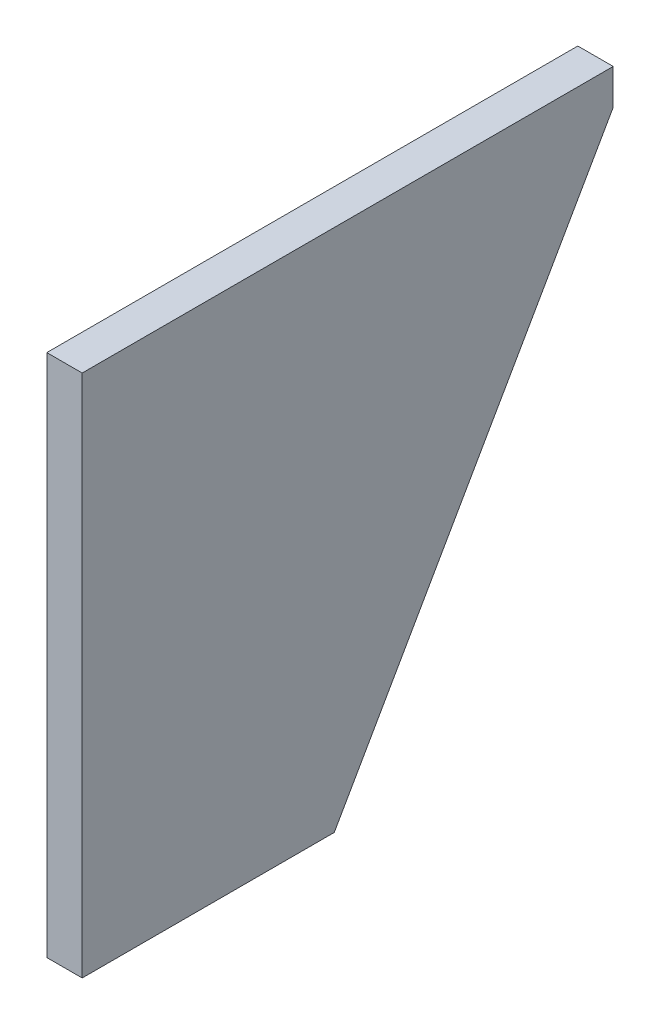
ISO-10303-21;
HEADER;
FILE_DESCRIPTION(('STEP AP214'),'2;1');
FILE_NAME('part.step','',(''),(''),'','','');
FILE_SCHEMA(('AUTOMOTIVE_DESIGN { 1 0 10303 214 1 1 1 1 }'));
ENDSEC;
DATA;
#1=APPLICATION_CONTEXT('core data for automotive mechanical design processes');
#2=APPLICATION_PROTOCOL_DEFINITION('international standard','automotive_design',2000,#1);
#3=PRODUCT_CONTEXT('',#1,'mechanical');
#4=PRODUCT('Part','Part','',(#3));
#5=PRODUCT_RELATED_PRODUCT_CATEGORY('part','',(#4));
#6=PRODUCT_DEFINITION_FORMATION('','',#4);
#7=PRODUCT_DEFINITION_CONTEXT('part definition',#1,'design');
#8=PRODUCT_DEFINITION('design','',#6,#7);
#9=PRODUCT_DEFINITION_SHAPE('','',#8);
#10=(LENGTH_UNIT() NAMED_UNIT(*) SI_UNIT(.MILLI.,.METRE.));
#11=(NAMED_UNIT(*) PLANE_ANGLE_UNIT() SI_UNIT($,.RADIAN.));
#12=(NAMED_UNIT(*) SI_UNIT($,.STERADIAN.) SOLID_ANGLE_UNIT());
#13=UNCERTAINTY_MEASURE_WITH_UNIT(LENGTH_MEASURE(1.E-05),#10,'distance_accuracy_value','');
#14=(GEOMETRIC_REPRESENTATION_CONTEXT(3) GLOBAL_UNCERTAINTY_ASSIGNED_CONTEXT((#13)) GLOBAL_UNIT_ASSIGNED_CONTEXT((#10,
#11,#12)) REPRESENTATION_CONTEXT('',''));
#15=CARTESIAN_POINT('',(0.,0.,0.));
#16=DIRECTION('',(0.,0.,1.));
#17=DIRECTION('',(1.,0.,0.));
#18=AXIS2_PLACEMENT_3D('',#15,#16,#17);
#19=CARTESIAN_POINT('',(-197.754092983453,111.353262198787,-40.1527686672779));
#20=DIRECTION('',(0.,-1.,0.));
#21=DIRECTION('',(0.,0.,-1.));
#22=AXIS2_PLACEMENT_3D('',#19,#20,#21);
#23=PLANE('',#22);
#24=DIRECTION('',(1.,0.,0.));
#25=VECTOR('',#24,1.);
#26=CARTESIAN_POINT('',(-197.754092983453,111.353262198787,334.847231332722));
#27=LINE('',#26,#25);
#28=CARTESIAN_POINT('',(-197.754092983453,111.353262198787,334.847231332722));
#29=VERTEX_POINT('',#28);
#30=CARTESIAN_POINT('',(-172.754092983453,111.353262198787,334.847231332722));
#31=VERTEX_POINT('',#30);
#32=EDGE_CURVE('E97',#29,#31,#27,.T.);
#33=ORIENTED_EDGE('',*,*,#32,.T.);
#34=DIRECTION('',(0.,0.,-1.));
#35=VECTOR('',#34,1.);
#36=CARTESIAN_POINT('',(-172.754092983453,111.353262198787,-40.1527686672779));
#37=LINE('',#36,#35);
#38=CARTESIAN_POINT('',(-172.754092983453,111.353262198787,-40.1527686672779));
#39=VERTEX_POINT('',#38);
#40=EDGE_CURVE('E91',#31,#39,#37,.T.);
#41=ORIENTED_EDGE('',*,*,#40,.T.);
#42=DIRECTION('',(1.,0.,0.));
#43=VECTOR('',#42,1.);
#44=CARTESIAN_POINT('',(-197.754092983453,111.353262198787,-40.1527686672779));
#45=LINE('',#44,#43);
#46=CARTESIAN_POINT('',(-197.754092983453,111.353262198787,-40.1527686672779));
#47=VERTEX_POINT('',#46);
#48=EDGE_CURVE('E11',#47,#39,#45,.T.);
#49=ORIENTED_EDGE('',*,*,#48,.F.);
#50=DIRECTION('',(0.,0.,-1.));
#51=VECTOR('',#50,1.);
#52=CARTESIAN_POINT('',(-197.754092983453,111.353262198787,-40.1527686672779));
#53=LINE('',#52,#51);
#54=EDGE_CURVE('E106',#29,#47,#53,.T.);
#55=ORIENTED_EDGE('',*,*,#54,.F.);
#56=EDGE_LOOP('',(#33,#41,#49,#55));
#57=FACE_BOUND('',#56,.T.);
#58=ADVANCED_FACE('F33',(#57),#23,.F.);
#59=CARTESIAN_POINT('',(-197.754092983453,86.3532621987867,-40.1527686672779));
#60=DIRECTION('',(0.,0.,1.));
#61=DIRECTION('',(1.,0.,0.));
#62=AXIS2_PLACEMENT_3D('',#59,#60,#61);
#63=PLANE('',#62);
#64=ORIENTED_EDGE('',*,*,#48,.T.);
#65=DIRECTION('',(0.,-1.,0.));
#66=VECTOR('',#65,1.);
#67=CARTESIAN_POINT('',(-172.754092983453,86.3532621987867,-40.1527686672779));
#68=LINE('',#67,#66);
#69=CARTESIAN_POINT('',(-172.754092983453,86.3532621987867,-40.1527686672779));
#70=VERTEX_POINT('',#69);
#71=EDGE_CURVE('E81',#39,#70,#68,.T.);
#72=ORIENTED_EDGE('',*,*,#71,.T.);
#73=DIRECTION('',(1.,0.,0.));
#74=VECTOR('',#73,1.);
#75=CARTESIAN_POINT('',(-197.754092983453,86.3532621987867,-40.1527686672779));
#76=LINE('',#75,#74);
#77=CARTESIAN_POINT('',(-197.754092983453,86.3532621987867,-40.1527686672779));
#78=VERTEX_POINT('',#77);
#79=EDGE_CURVE('E40',#78,#70,#76,.T.);
#80=ORIENTED_EDGE('',*,*,#79,.F.);
#81=DIRECTION('',(0.,-1.,0.));
#82=VECTOR('',#81,1.);
#83=CARTESIAN_POINT('',(-197.754092983453,86.3532621987867,-40.1527686672779));
#84=LINE('',#83,#82);
#85=EDGE_CURVE('E82',#47,#78,#84,.T.);
#86=ORIENTED_EDGE('',*,*,#85,.F.);
#87=EDGE_LOOP('',(#64,#72,#80,#86));
#88=FACE_BOUND('',#87,.T.);
#89=ADVANCED_FACE('F79',(#88),#63,.F.);
#90=CARTESIAN_POINT('',(-197.754092983453,-258.646737801213,156.847231332722));
#91=DIRECTION('',(0.,0.495867842337819,0.86839799800278));
#92=DIRECTION('',(0.,-0.86839799800278,0.495867842337819));
#93=AXIS2_PLACEMENT_3D('',#90,#91,#92);
#94=PLANE('',#93);
#95=ORIENTED_EDGE('',*,*,#79,.T.);
#96=DIRECTION('',(0.,-0.86839799800278,0.495867842337819));
#97=VECTOR('',#96,1.);
#98=CARTESIAN_POINT('',(-172.754092983453,-258.646737801213,156.847231332722));
#99=LINE('',#98,#97);
#100=CARTESIAN_POINT('',(-172.754092983453,-258.646737801213,156.847231332722));
#101=VERTEX_POINT('',#100);
#102=EDGE_CURVE('E95',#70,#101,#99,.T.);
#103=ORIENTED_EDGE('',*,*,#102,.T.);
#104=DIRECTION('',(1.,0.,0.));
#105=VECTOR('',#104,1.);
#106=CARTESIAN_POINT('',(-197.754092983453,-258.646737801213,156.847231332722));
#107=LINE('',#106,#105);
#108=CARTESIAN_POINT('',(-197.754092983453,-258.646737801213,156.847231332722));
#109=VERTEX_POINT('',#108);
#110=EDGE_CURVE('E116',#109,#101,#107,.T.);
#111=ORIENTED_EDGE('',*,*,#110,.F.);
#112=DIRECTION('',(0.,-0.86839799800278,0.495867842337819));
#113=VECTOR('',#112,1.);
#114=CARTESIAN_POINT('',(-197.754092983453,-258.646737801213,156.847231332722));
#115=LINE('',#114,#113);
#116=EDGE_CURVE('E109',#78,#109,#115,.T.);
#117=ORIENTED_EDGE('',*,*,#116,.F.);
#118=EDGE_LOOP('',(#95,#103,#111,#117));
#119=FACE_BOUND('',#118,.T.);
#120=ADVANCED_FACE('F119',(#119),#94,.F.);
#121=CARTESIAN_POINT('',(-197.754092983453,-258.646737801213,334.847231332722));
#122=DIRECTION('',(0.,1.,0.));
#123=DIRECTION('',(0.,0.,1.));
#124=AXIS2_PLACEMENT_3D('',#121,#122,#123);
#125=PLANE('',#124);
#126=ORIENTED_EDGE('',*,*,#110,.T.);
#127=DIRECTION('',(0.,0.,1.));
#128=VECTOR('',#127,1.);
#129=CARTESIAN_POINT('',(-172.754092983453,-258.646737801213,334.847231332722));
#130=LINE('',#129,#128);
#131=CARTESIAN_POINT('',(-172.754092983453,-258.646737801213,334.847231332722));
#132=VERTEX_POINT('',#131);
#133=EDGE_CURVE('E101',#101,#132,#130,.T.);
#134=ORIENTED_EDGE('',*,*,#133,.T.);
#135=DIRECTION('',(1.,0.,0.));
#136=VECTOR('',#135,1.);
#137=CARTESIAN_POINT('',(-197.754092983453,-258.646737801213,334.847231332722));
#138=LINE('',#137,#136);
#139=CARTESIAN_POINT('',(-197.754092983453,-258.646737801213,334.847231332722));
#140=VERTEX_POINT('',#139);
#141=EDGE_CURVE('E114',#140,#132,#138,.T.);
#142=ORIENTED_EDGE('',*,*,#141,.F.);
#143=DIRECTION('',(0.,0.,1.));
#144=VECTOR('',#143,1.);
#145=CARTESIAN_POINT('',(-197.754092983453,-258.646737801213,334.847231332722));
#146=LINE('',#145,#144);
#147=EDGE_CURVE('E52',#109,#140,#146,.T.);
#148=ORIENTED_EDGE('',*,*,#147,.F.);
#149=EDGE_LOOP('',(#126,#134,#142,#148));
#150=FACE_BOUND('',#149,.T.);
#151=ADVANCED_FACE('F130',(#150),#125,.F.);
#152=CARTESIAN_POINT('',(-197.754092983453,111.353262198787,334.847231332722));
#153=DIRECTION('',(0.,0.,-1.));
#154=DIRECTION('',(-1.,0.,0.));
#155=AXIS2_PLACEMENT_3D('',#152,#153,#154);
#156=PLANE('',#155);
#157=ORIENTED_EDGE('',*,*,#141,.T.);
#158=DIRECTION('',(0.,1.,0.));
#159=VECTOR('',#158,1.);
#160=CARTESIAN_POINT('',(-172.754092983453,111.353262198787,334.847231332722));
#161=LINE('',#160,#159);
#162=EDGE_CURVE('E104',#132,#31,#161,.T.);
#163=ORIENTED_EDGE('',*,*,#162,.T.);
#164=ORIENTED_EDGE('',*,*,#32,.F.);
#165=DIRECTION('',(0.,1.,0.));
#166=VECTOR('',#165,1.);
#167=CARTESIAN_POINT('',(-197.754092983453,111.353262198787,334.847231332722));
#168=LINE('',#167,#166);
#169=EDGE_CURVE('E47',#140,#29,#168,.T.);
#170=ORIENTED_EDGE('',*,*,#169,.F.);
#171=EDGE_LOOP('',(#157,#163,#164,#170));
#172=FACE_BOUND('',#171,.T.);
#173=ADVANCED_FACE('F123',(#172),#156,.F.);
#174=CARTESIAN_POINT('',(-197.754092983453,0.,0.));
#175=DIRECTION('',(1.,0.,0.));
#176=DIRECTION('',(0.,0.,-1.));
#177=AXIS2_PLACEMENT_3D('',#174,#175,#176);
#178=PLANE('',#177);
#179=ORIENTED_EDGE('',*,*,#54,.T.);
#180=ORIENTED_EDGE('',*,*,#85,.T.);
#181=ORIENTED_EDGE('',*,*,#116,.T.);
#182=ORIENTED_EDGE('',*,*,#147,.T.);
#183=ORIENTED_EDGE('',*,*,#169,.T.);
#184=EDGE_LOOP('',(#179,#180,#181,#182,#183));
#185=FACE_BOUND('',#184,.T.);
#186=ADVANCED_FACE('F121',(#185),#178,.F.);
#187=CARTESIAN_POINT('',(-172.754092983453,0.,0.));
#188=DIRECTION('',(1.,0.,0.));
#189=DIRECTION('',(0.,0.,-1.));
#190=AXIS2_PLACEMENT_3D('',#187,#188,#189);
#191=PLANE('',#190);
#192=ORIENTED_EDGE('',*,*,#40,.F.);
#193=ORIENTED_EDGE('',*,*,#162,.F.);
#194=ORIENTED_EDGE('',*,*,#133,.F.);
#195=ORIENTED_EDGE('',*,*,#102,.F.);
#196=ORIENTED_EDGE('',*,*,#71,.F.);
#197=EDGE_LOOP('',(#192,#193,#194,#195,#196));
#198=FACE_BOUND('',#197,.T.);
#199=ADVANCED_FACE('F89',(#198),#191,.T.);
#200=CLOSED_SHELL('',(#58,#89,#120,#151,#173,#186,#199));
#201=MANIFOLD_SOLID_BREP('B2',#200);
#202=ADVANCED_BREP_SHAPE_REPRESENTATION('',(#18,#201),#14);
#203=SHAPE_DEFINITION_REPRESENTATION(#9,#202);
ENDSEC;
END-ISO-10303-21;
